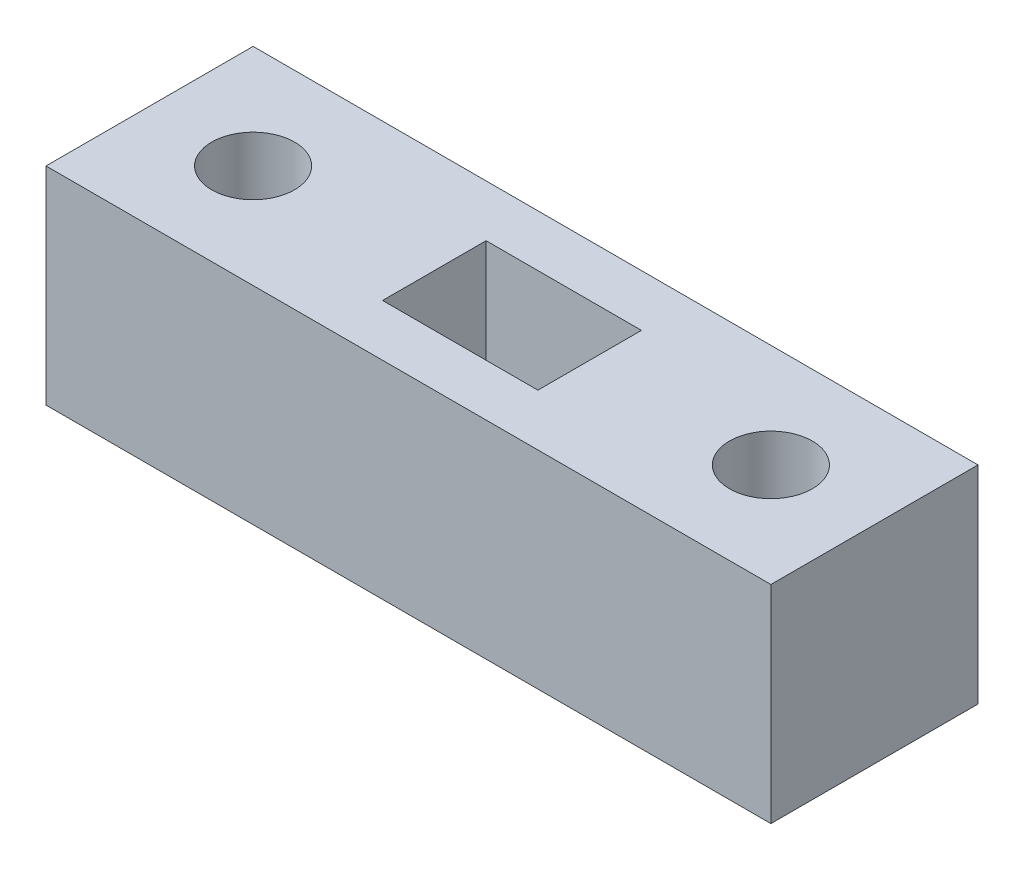
ISO-10303-21;
HEADER;
FILE_DESCRIPTION(('STEP AP214'),'2;1');
FILE_NAME('part.step','',(''),(''),'','','');
FILE_SCHEMA(('AUTOMOTIVE_DESIGN { 1 0 10303 214 1 1 1 1 }'));
ENDSEC;
DATA;
#1=APPLICATION_CONTEXT('core data for automotive mechanical design processes');
#2=APPLICATION_PROTOCOL_DEFINITION('international standard','automotive_design',2000,#1);
#3=PRODUCT_CONTEXT('',#1,'mechanical');
#4=PRODUCT('Part','Part','',(#3));
#5=PRODUCT_RELATED_PRODUCT_CATEGORY('part','',(#4));
#6=PRODUCT_DEFINITION_FORMATION('','',#4);
#7=PRODUCT_DEFINITION_CONTEXT('part definition',#1,'design');
#8=PRODUCT_DEFINITION('design','',#6,#7);
#9=PRODUCT_DEFINITION_SHAPE('','',#8);
#10=(LENGTH_UNIT() NAMED_UNIT(*) SI_UNIT(.MILLI.,.METRE.));
#11=(NAMED_UNIT(*) PLANE_ANGLE_UNIT() SI_UNIT($,.RADIAN.));
#12=(NAMED_UNIT(*) SI_UNIT($,.STERADIAN.) SOLID_ANGLE_UNIT());
#13=UNCERTAINTY_MEASURE_WITH_UNIT(LENGTH_MEASURE(1.E-05),#10,'distance_accuracy_value','');
#14=(GEOMETRIC_REPRESENTATION_CONTEXT(3) GLOBAL_UNCERTAINTY_ASSIGNED_CONTEXT((#13)) GLOBAL_UNIT_ASSIGNED_CONTEXT((#10,
#11,#12)) REPRESENTATION_CONTEXT('',''));
#15=CARTESIAN_POINT('',(0.,0.,0.));
#16=DIRECTION('',(0.,0.,1.));
#17=DIRECTION('',(1.,0.,0.));
#18=AXIS2_PLACEMENT_3D('',#15,#16,#17);
#19=CARTESIAN_POINT('',(0.,20.,0.));
#20=DIRECTION('',(0.,-1.,0.));
#21=DIRECTION('',(0.,0.,-1.));
#22=AXIS2_PLACEMENT_3D('',#19,#20,#21);
#23=PLANE('',#22);
#24=CARTESIAN_POINT('',(25.,20.,0.));
#25=DIRECTION('',(0.,1.,0.));
#26=DIRECTION('',(0.,0.,-1.));
#27=AXIS2_PLACEMENT_3D('',#24,#25,#26);
#28=CIRCLE('',#27,4.);
#29=CARTESIAN_POINT('',(25.,20.,-4.00000000000001));
#30=VERTEX_POINT('',#29);
#31=EDGE_CURVE('E153',#30,#30,#28,.T.);
#32=ORIENTED_EDGE('',*,*,#31,.F.);
#33=EDGE_LOOP('',(#32));
#34=FACE_BOUND('',#33,.T.);
#35=CARTESIAN_POINT('',(-25.,20.,0.));
#36=DIRECTION('',(0.,1.,0.));
#37=DIRECTION('',(0.,0.,1.));
#38=AXIS2_PLACEMENT_3D('',#35,#36,#37);
#39=CIRCLE('',#38,4.);
#40=CARTESIAN_POINT('',(-25.,20.,4.));
#41=VERTEX_POINT('',#40);
#42=EDGE_CURVE('E161',#41,#41,#39,.T.);
#43=ORIENTED_EDGE('',*,*,#42,.F.);
#44=EDGE_LOOP('',(#43));
#45=FACE_BOUND('',#44,.T.);
#46=DIRECTION('',(0.,0.,-1.));
#47=VECTOR('',#46,1.);
#48=CARTESIAN_POINT('',(35.,20.,10.));
#49=LINE('',#48,#47);
#50=CARTESIAN_POINT('',(35.,20.,10.));
#51=VERTEX_POINT('',#50);
#52=CARTESIAN_POINT('',(35.,20.,-10.));
#53=VERTEX_POINT('',#52);
#54=EDGE_CURVE('E169',#51,#53,#49,.T.);
#55=ORIENTED_EDGE('',*,*,#54,.T.);
#56=DIRECTION('',(-1.,0.,0.));
#57=VECTOR('',#56,1.);
#58=CARTESIAN_POINT('',(-35.,20.,-10.));
#59=LINE('',#58,#57);
#60=CARTESIAN_POINT('',(-35.,20.,-10.));
#61=VERTEX_POINT('',#60);
#62=EDGE_CURVE('E173',#53,#61,#59,.T.);
#63=ORIENTED_EDGE('',*,*,#62,.T.);
#64=DIRECTION('',(0.,0.,1.));
#65=VECTOR('',#64,1.);
#66=CARTESIAN_POINT('',(-35.,20.,10.));
#67=LINE('',#66,#65);
#68=CARTESIAN_POINT('',(-35.,20.,10.));
#69=VERTEX_POINT('',#68);
#70=EDGE_CURVE('E177',#61,#69,#67,.T.);
#71=ORIENTED_EDGE('',*,*,#70,.T.);
#72=DIRECTION('',(1.,0.,0.));
#73=VECTOR('',#72,1.);
#74=CARTESIAN_POINT('',(-35.,20.,10.));
#75=LINE('',#74,#73);
#76=EDGE_CURVE('E180',#69,#51,#75,.T.);
#77=ORIENTED_EDGE('',*,*,#76,.T.);
#78=EDGE_LOOP('',(#55,#63,#71,#77));
#79=FACE_BOUND('',#78,.T.);
#80=DIRECTION('',(0.,0.,-1.));
#81=VECTOR('',#80,1.);
#82=CARTESIAN_POINT('',(7.5,20.,5.));
#83=LINE('',#82,#81);
#84=CARTESIAN_POINT('',(7.5,20.,5.));
#85=VERTEX_POINT('',#84);
#86=CARTESIAN_POINT('',(7.5,20.,-5.));
#87=VERTEX_POINT('',#86);
#88=EDGE_CURVE('E105',#85,#87,#83,.T.);
#89=ORIENTED_EDGE('',*,*,#88,.F.);
#90=DIRECTION('',(1.,0.,0.));
#91=VECTOR('',#90,1.);
#92=CARTESIAN_POINT('',(-7.5,20.,5.));
#93=LINE('',#92,#91);
#94=CARTESIAN_POINT('',(-7.5,20.,5.));
#95=VERTEX_POINT('',#94);
#96=EDGE_CURVE('E131',#95,#85,#93,.T.);
#97=ORIENTED_EDGE('',*,*,#96,.F.);
#98=DIRECTION('',(0.,0.,1.));
#99=VECTOR('',#98,1.);
#100=CARTESIAN_POINT('',(-7.5,20.,5.));
#101=LINE('',#100,#99);
#102=CARTESIAN_POINT('',(-7.5,20.,-5.));
#103=VERTEX_POINT('',#102);
#104=EDGE_CURVE('E127',#103,#95,#101,.T.);
#105=ORIENTED_EDGE('',*,*,#104,.F.);
#106=DIRECTION('',(-1.,0.,0.));
#107=VECTOR('',#106,1.);
#108=CARTESIAN_POINT('',(-7.5,20.,-5.));
#109=LINE('',#108,#107);
#110=EDGE_CURVE('E114',#87,#103,#109,.T.);
#111=ORIENTED_EDGE('',*,*,#110,.F.);
#112=EDGE_LOOP('',(#89,#97,#105,#111));
#113=FACE_BOUND('',#112,.T.);
#114=ADVANCED_FACE('F39',(#34,#45,#79,#113),#23,.F.);
#115=CARTESIAN_POINT('',(0.,0.,0.));
#116=DIRECTION('',(0.,-1.,0.));
#117=DIRECTION('',(0.,0.,-1.));
#118=AXIS2_PLACEMENT_3D('',#115,#116,#117);
#119=PLANE('',#118);
#120=CARTESIAN_POINT('',(-25.,0.,0.));
#121=DIRECTION('',(0.,1.,0.));
#122=DIRECTION('',(0.,0.,1.));
#123=AXIS2_PLACEMENT_3D('',#120,#121,#122);
#124=CIRCLE('',#123,4.);
#125=CARTESIAN_POINT('',(-25.,0.,4.));
#126=VERTEX_POINT('',#125);
#127=EDGE_CURVE('E157',#126,#126,#124,.T.);
#128=ORIENTED_EDGE('',*,*,#127,.T.);
#129=EDGE_LOOP('',(#128));
#130=FACE_BOUND('',#129,.T.);
#131=DIRECTION('',(0.,0.,-1.));
#132=VECTOR('',#131,1.);
#133=CARTESIAN_POINT('',(35.,0.,10.));
#134=LINE('',#133,#132);
#135=CARTESIAN_POINT('',(35.,0.,10.));
#136=VERTEX_POINT('',#135);
#137=CARTESIAN_POINT('',(35.,0.,-10.));
#138=VERTEX_POINT('',#137);
#139=EDGE_CURVE('E165',#136,#138,#134,.T.);
#140=ORIENTED_EDGE('',*,*,#139,.F.);
#141=DIRECTION('',(1.,0.,0.));
#142=VECTOR('',#141,1.);
#143=CARTESIAN_POINT('',(-35.,0.,10.));
#144=LINE('',#143,#142);
#145=CARTESIAN_POINT('',(-35.,0.,10.));
#146=VERTEX_POINT('',#145);
#147=EDGE_CURVE('E174',#146,#136,#144,.T.);
#148=ORIENTED_EDGE('',*,*,#147,.F.);
#149=DIRECTION('',(0.,0.,1.));
#150=VECTOR('',#149,1.);
#151=CARTESIAN_POINT('',(-35.,0.,10.));
#152=LINE('',#151,#150);
#153=CARTESIAN_POINT('',(-35.,0.,-10.));
#154=VERTEX_POINT('',#153);
#155=EDGE_CURVE('E190',#154,#146,#152,.T.);
#156=ORIENTED_EDGE('',*,*,#155,.F.);
#157=DIRECTION('',(-1.,0.,0.));
#158=VECTOR('',#157,1.);
#159=CARTESIAN_POINT('',(-35.,0.,-10.));
#160=LINE('',#159,#158);
#161=EDGE_CURVE('E187',#138,#154,#160,.T.);
#162=ORIENTED_EDGE('',*,*,#161,.F.);
#163=EDGE_LOOP('',(#140,#148,#156,#162));
#164=FACE_BOUND('',#163,.T.);
#165=CARTESIAN_POINT('',(25.,0.,0.));
#166=DIRECTION('',(0.,1.,0.));
#167=DIRECTION('',(0.,0.,-1.));
#168=AXIS2_PLACEMENT_3D('',#165,#166,#167);
#169=CIRCLE('',#168,4.);
#170=CARTESIAN_POINT('',(25.,0.,-4.00000000000001));
#171=VERTEX_POINT('',#170);
#172=EDGE_CURVE('E123',#171,#171,#169,.T.);
#173=ORIENTED_EDGE('',*,*,#172,.T.);
#174=EDGE_LOOP('',(#173));
#175=FACE_BOUND('',#174,.T.);
#176=DIRECTION('',(1.,0.,0.));
#177=VECTOR('',#176,1.);
#178=CARTESIAN_POINT('',(-7.5,0.,5.));
#179=LINE('',#178,#177);
#180=CARTESIAN_POINT('',(-7.5,0.,5.));
#181=VERTEX_POINT('',#180);
#182=CARTESIAN_POINT('',(7.5,0.,5.));
#183=VERTEX_POINT('',#182);
#184=EDGE_CURVE('E115',#181,#183,#179,.T.);
#185=ORIENTED_EDGE('',*,*,#184,.T.);
#186=DIRECTION('',(0.,0.,-1.));
#187=VECTOR('',#186,1.);
#188=CARTESIAN_POINT('',(7.5,0.,5.));
#189=LINE('',#188,#187);
#190=CARTESIAN_POINT('',(7.5,0.,-5.));
#191=VERTEX_POINT('',#190);
#192=EDGE_CURVE('E63',#183,#191,#189,.T.);
#193=ORIENTED_EDGE('',*,*,#192,.T.);
#194=DIRECTION('',(-1.,0.,0.));
#195=VECTOR('',#194,1.);
#196=CARTESIAN_POINT('',(-7.5,0.,-5.));
#197=LINE('',#196,#195);
#198=CARTESIAN_POINT('',(-7.5,0.,-5.));
#199=VERTEX_POINT('',#198);
#200=EDGE_CURVE('E121',#191,#199,#197,.T.);
#201=ORIENTED_EDGE('',*,*,#200,.T.);
#202=DIRECTION('',(0.,0.,1.));
#203=VECTOR('',#202,1.);
#204=CARTESIAN_POINT('',(-7.5,0.,5.));
#205=LINE('',#204,#203);
#206=EDGE_CURVE('E140',#199,#181,#205,.T.);
#207=ORIENTED_EDGE('',*,*,#206,.T.);
#208=EDGE_LOOP('',(#185,#193,#201,#207));
#209=FACE_BOUND('',#208,.T.);
#210=ADVANCED_FACE('F213',(#130,#164,#175,#209),#119,.T.);
#211=CARTESIAN_POINT('',(35.,20.,10.));
#212=DIRECTION('',(-1.,0.,0.));
#213=DIRECTION('',(0.,0.,1.));
#214=AXIS2_PLACEMENT_3D('',#211,#212,#213);
#215=PLANE('',#214);
#216=ORIENTED_EDGE('',*,*,#139,.T.);
#217=DIRECTION('',(0.,-1.,0.));
#218=VECTOR('',#217,1.);
#219=CARTESIAN_POINT('',(35.,20.,-10.));
#220=LINE('',#219,#218);
#221=EDGE_CURVE('E11',#53,#138,#220,.T.);
#222=ORIENTED_EDGE('',*,*,#221,.F.);
#223=ORIENTED_EDGE('',*,*,#54,.F.);
#224=DIRECTION('',(0.,-1.,0.));
#225=VECTOR('',#224,1.);
#226=CARTESIAN_POINT('',(35.,20.,10.));
#227=LINE('',#226,#225);
#228=EDGE_CURVE('E183',#51,#136,#227,.T.);
#229=ORIENTED_EDGE('',*,*,#228,.T.);
#230=EDGE_LOOP('',(#216,#222,#223,#229));
#231=FACE_BOUND('',#230,.T.);
#232=ADVANCED_FACE('F41',(#231),#215,.F.);
#233=CARTESIAN_POINT('',(-35.,20.,-10.));
#234=DIRECTION('',(0.,0.,1.));
#235=DIRECTION('',(1.,0.,0.));
#236=AXIS2_PLACEMENT_3D('',#233,#234,#235);
#237=PLANE('',#236);
#238=ORIENTED_EDGE('',*,*,#161,.T.);
#239=DIRECTION('',(0.,-1.,0.));
#240=VECTOR('',#239,1.);
#241=CARTESIAN_POINT('',(-35.,20.,-10.));
#242=LINE('',#241,#240);
#243=EDGE_CURVE('E48',#61,#154,#242,.T.);
#244=ORIENTED_EDGE('',*,*,#243,.F.);
#245=ORIENTED_EDGE('',*,*,#62,.F.);
#246=ORIENTED_EDGE('',*,*,#221,.T.);
#247=EDGE_LOOP('',(#238,#244,#245,#246));
#248=FACE_BOUND('',#247,.T.);
#249=ADVANCED_FACE('F223',(#248),#237,.F.);
#250=CARTESIAN_POINT('',(-35.,20.,10.));
#251=DIRECTION('',(1.,0.,0.));
#252=DIRECTION('',(0.,0.,-1.));
#253=AXIS2_PLACEMENT_3D('',#250,#251,#252);
#254=PLANE('',#253);
#255=ORIENTED_EDGE('',*,*,#155,.T.);
#256=DIRECTION('',(0.,-1.,0.));
#257=VECTOR('',#256,1.);
#258=CARTESIAN_POINT('',(-35.,20.,10.));
#259=LINE('',#258,#257);
#260=EDGE_CURVE('E198',#69,#146,#259,.T.);
#261=ORIENTED_EDGE('',*,*,#260,.F.);
#262=ORIENTED_EDGE('',*,*,#70,.F.);
#263=ORIENTED_EDGE('',*,*,#243,.T.);
#264=EDGE_LOOP('',(#255,#261,#262,#263));
#265=FACE_BOUND('',#264,.T.);
#266=ADVANCED_FACE('F207',(#265),#254,.F.);
#267=CARTESIAN_POINT('',(-35.,20.,10.));
#268=DIRECTION('',(0.,0.,-1.));
#269=DIRECTION('',(-1.,0.,0.));
#270=AXIS2_PLACEMENT_3D('',#267,#268,#269);
#271=PLANE('',#270);
#272=ORIENTED_EDGE('',*,*,#147,.T.);
#273=ORIENTED_EDGE('',*,*,#228,.F.);
#274=ORIENTED_EDGE('',*,*,#76,.F.);
#275=ORIENTED_EDGE('',*,*,#260,.T.);
#276=EDGE_LOOP('',(#272,#273,#274,#275));
#277=FACE_BOUND('',#276,.T.);
#278=ADVANCED_FACE('F217',(#277),#271,.F.);
#279=CARTESIAN_POINT('',(-25.,20.,0.));
#280=DIRECTION('',(0.,-1.,0.));
#281=DIRECTION('',(0.,0.,-1.));
#282=AXIS2_PLACEMENT_3D('',#279,#280,#281);
#283=CYLINDRICAL_SURFACE('',#282,4.);
#284=ORIENTED_EDGE('',*,*,#42,.T.);
#285=EDGE_LOOP('',(#284));
#286=FACE_BOUND('',#285,.T.);
#287=ORIENTED_EDGE('',*,*,#127,.F.);
#288=EDGE_LOOP('',(#287));
#289=FACE_BOUND('',#288,.T.);
#290=ADVANCED_FACE('F241',(#286,#289),#283,.F.);
#291=CARTESIAN_POINT('',(25.,20.,0.));
#292=DIRECTION('',(0.,-1.,0.));
#293=DIRECTION('',(0.,0.,-1.));
#294=AXIS2_PLACEMENT_3D('',#291,#292,#293);
#295=CYLINDRICAL_SURFACE('',#294,4.);
#296=ORIENTED_EDGE('',*,*,#31,.T.);
#297=EDGE_LOOP('',(#296));
#298=FACE_BOUND('',#297,.T.);
#299=ORIENTED_EDGE('',*,*,#172,.F.);
#300=EDGE_LOOP('',(#299));
#301=FACE_BOUND('',#300,.T.);
#302=ADVANCED_FACE('F248',(#298,#301),#295,.F.);
#303=CARTESIAN_POINT('',(7.5,20.,5.));
#304=DIRECTION('',(-1.,0.,0.));
#305=DIRECTION('',(0.,0.,1.));
#306=AXIS2_PLACEMENT_3D('',#303,#304,#305);
#307=PLANE('',#306);
#308=ORIENTED_EDGE('',*,*,#192,.F.);
#309=DIRECTION('',(0.,-1.,0.));
#310=VECTOR('',#309,1.);
#311=CARTESIAN_POINT('',(7.5,20.,5.));
#312=LINE('',#311,#310);
#313=EDGE_CURVE('E109',#85,#183,#312,.T.);
#314=ORIENTED_EDGE('',*,*,#313,.F.);
#315=ORIENTED_EDGE('',*,*,#88,.T.);
#316=DIRECTION('',(0.,-1.,0.));
#317=VECTOR('',#316,1.);
#318=CARTESIAN_POINT('',(7.5,20.,-5.));
#319=LINE('',#318,#317);
#320=EDGE_CURVE('E108',#87,#191,#319,.T.);
#321=ORIENTED_EDGE('',*,*,#320,.T.);
#322=EDGE_LOOP('',(#308,#314,#315,#321));
#323=FACE_BOUND('',#322,.T.);
#324=ADVANCED_FACE('F107',(#323),#307,.T.);
#325=CARTESIAN_POINT('',(-7.5,20.,-5.));
#326=DIRECTION('',(0.,0.,1.));
#327=DIRECTION('',(1.,0.,0.));
#328=AXIS2_PLACEMENT_3D('',#325,#326,#327);
#329=PLANE('',#328);
#330=ORIENTED_EDGE('',*,*,#200,.F.);
#331=ORIENTED_EDGE('',*,*,#320,.F.);
#332=ORIENTED_EDGE('',*,*,#110,.T.);
#333=DIRECTION('',(0.,-1.,0.));
#334=VECTOR('',#333,1.);
#335=CARTESIAN_POINT('',(-7.5,20.,-5.));
#336=LINE('',#335,#334);
#337=EDGE_CURVE('E124',#103,#199,#336,.T.);
#338=ORIENTED_EDGE('',*,*,#337,.T.);
#339=EDGE_LOOP('',(#330,#331,#332,#338));
#340=FACE_BOUND('',#339,.T.);
#341=ADVANCED_FACE('F118',(#340),#329,.T.);
#342=CARTESIAN_POINT('',(-7.5,20.,5.));
#343=DIRECTION('',(1.,0.,0.));
#344=DIRECTION('',(0.,0.,-1.));
#345=AXIS2_PLACEMENT_3D('',#342,#343,#344);
#346=PLANE('',#345);
#347=ORIENTED_EDGE('',*,*,#206,.F.);
#348=ORIENTED_EDGE('',*,*,#337,.F.);
#349=ORIENTED_EDGE('',*,*,#104,.T.);
#350=DIRECTION('',(0.,-1.,0.));
#351=VECTOR('',#350,1.);
#352=CARTESIAN_POINT('',(-7.5,20.,5.));
#353=LINE('',#352,#351);
#354=EDGE_CURVE('E55',#95,#181,#353,.T.);
#355=ORIENTED_EDGE('',*,*,#354,.T.);
#356=EDGE_LOOP('',(#347,#348,#349,#355));
#357=FACE_BOUND('',#356,.T.);
#358=ADVANCED_FACE('F265',(#357),#346,.T.);
#359=CARTESIAN_POINT('',(-7.5,20.,5.));
#360=DIRECTION('',(0.,0.,-1.));
#361=DIRECTION('',(-1.,0.,0.));
#362=AXIS2_PLACEMENT_3D('',#359,#360,#361);
#363=PLANE('',#362);
#364=ORIENTED_EDGE('',*,*,#184,.F.);
#365=ORIENTED_EDGE('',*,*,#354,.F.);
#366=ORIENTED_EDGE('',*,*,#96,.T.);
#367=ORIENTED_EDGE('',*,*,#313,.T.);
#368=EDGE_LOOP('',(#364,#365,#366,#367));
#369=FACE_BOUND('',#368,.T.);
#370=ADVANCED_FACE('F268',(#369),#363,.T.);
#371=CLOSED_SHELL('',(#114,#210,#232,#249,#266,#278,#290,#302,#324,#341,#358,#370));
#372=MANIFOLD_SOLID_BREP('B2',#371);
#373=ADVANCED_BREP_SHAPE_REPRESENTATION('',(#18,#372),#14);
#374=SHAPE_DEFINITION_REPRESENTATION(#9,#373);
ENDSEC;
END-ISO-10303-21;
